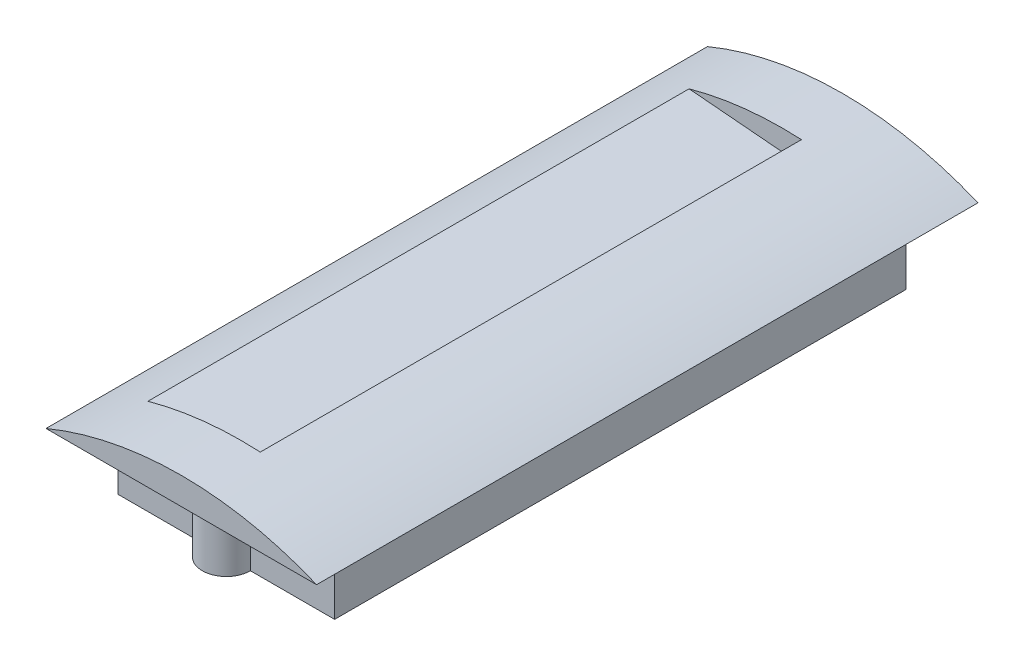
ISO-10303-21;
HEADER;
FILE_DESCRIPTION(('STEP AP214'),'2;1');
FILE_NAME('part.step','',(''),(''),'','','');
FILE_SCHEMA(('AUTOMOTIVE_DESIGN { 1 0 10303 214 1 1 1 1 }'));
ENDSEC;
DATA;
#1=APPLICATION_CONTEXT('core data for automotive mechanical design processes');
#2=APPLICATION_PROTOCOL_DEFINITION('international standard','automotive_design',2000,#1);
#3=PRODUCT_CONTEXT('',#1,'mechanical');
#4=PRODUCT('Part','Part','',(#3));
#5=PRODUCT_RELATED_PRODUCT_CATEGORY('part','',(#4));
#6=PRODUCT_DEFINITION_FORMATION('','',#4);
#7=PRODUCT_DEFINITION_CONTEXT('part definition',#1,'design');
#8=PRODUCT_DEFINITION('design','',#6,#7);
#9=PRODUCT_DEFINITION_SHAPE('','',#8);
#10=(LENGTH_UNIT() NAMED_UNIT(*) SI_UNIT(.MILLI.,.METRE.));
#11=(NAMED_UNIT(*) PLANE_ANGLE_UNIT() SI_UNIT($,.RADIAN.));
#12=(NAMED_UNIT(*) SI_UNIT($,.STERADIAN.) SOLID_ANGLE_UNIT());
#13=UNCERTAINTY_MEASURE_WITH_UNIT(LENGTH_MEASURE(1.E-05),#10,'distance_accuracy_value','');
#14=(GEOMETRIC_REPRESENTATION_CONTEXT(3) GLOBAL_UNCERTAINTY_ASSIGNED_CONTEXT((#13)) GLOBAL_UNIT_ASSIGNED_CONTEXT((#10,
#11,#12)) REPRESENTATION_CONTEXT('',''));
#15=CARTESIAN_POINT('',(0.,0.,0.));
#16=DIRECTION('',(0.,0.,1.));
#17=DIRECTION('',(1.,0.,0.));
#18=AXIS2_PLACEMENT_3D('',#15,#16,#17);
#19=CARTESIAN_POINT('',(22.5,-54.,110.));
#20=DIRECTION('',(0.,0.,-1.));
#21=DIRECTION('',(-1.,0.,0.));
#22=AXIS2_PLACEMENT_3D('',#19,#20,#21);
#23=CYLINDRICAL_SURFACE('',#22,58.5);
#24=CARTESIAN_POINT('',(22.5,-54.,0.));
#25=DIRECTION('',(0.,0.,1.));
#26=DIRECTION('',(-1.,0.,0.));
#27=AXIS2_PLACEMENT_3D('',#24,#25,#26);
#28=CIRCLE('',#27,58.5);
#29=CARTESIAN_POINT('',(45.,0.,0.));
#30=VERTEX_POINT('',#29);
#31=CARTESIAN_POINT('',(0.,0.,0.));
#32=VERTEX_POINT('',#31);
#33=EDGE_CURVE('E209',#30,#32,#28,.T.);
#34=ORIENTED_EDGE('',*,*,#33,.T.);
#35=DIRECTION('',(0.,0.,-1.));
#36=VECTOR('',#35,1.);
#37=CARTESIAN_POINT('',(0.,0.,110.));
#38=LINE('',#37,#36);
#39=CARTESIAN_POINT('',(0.,0.,110.));
#40=VERTEX_POINT('',#39);
#41=EDGE_CURVE('E122',#40,#32,#38,.T.);
#42=ORIENTED_EDGE('',*,*,#41,.F.);
#43=CARTESIAN_POINT('',(22.5,-54.,110.));
#44=DIRECTION('',(0.,0.,1.));
#45=DIRECTION('',(-1.,0.,0.));
#46=AXIS2_PLACEMENT_3D('',#43,#44,#45);
#47=CIRCLE('',#46,58.5);
#48=CARTESIAN_POINT('',(45.,0.,110.));
#49=VERTEX_POINT('',#48);
#50=EDGE_CURVE('E210',#49,#40,#47,.T.);
#51=ORIENTED_EDGE('',*,*,#50,.F.);
#52=DIRECTION('',(0.,0.,-1.));
#53=VECTOR('',#52,1.);
#54=CARTESIAN_POINT('',(45.,0.,110.));
#55=LINE('',#54,#53);
#56=EDGE_CURVE('E216',#49,#30,#55,.T.);
#57=ORIENTED_EDGE('',*,*,#56,.T.);
#58=EDGE_LOOP('',(#34,#42,#51,#57));
#59=FACE_BOUND('',#58,.T.);
#60=CARTESIAN_POINT('',(22.5,-54.,9.99999999999999));
#61=DIRECTION('',(0.,0.,1.));
#62=DIRECTION('',(1.,0.,0.));
#63=AXIS2_PLACEMENT_3D('',#60,#61,#62);
#64=CIRCLE('',#63,58.5);
#65=CARTESIAN_POINT('',(25.6355375998647,4.415908825934,10.));
#66=VERTEX_POINT('',#65);
#67=CARTESIAN_POINT('',(6.95185149151565,2.39596685897064,9.99999999999999));
#68=VERTEX_POINT('',#67);
#69=EDGE_CURVE('E11',#66,#68,#64,.T.);
#70=ORIENTED_EDGE('',*,*,#69,.F.);
#71=DIRECTION('',(0.,0.,1.));
#72=VECTOR('',#71,1.);
#73=CARTESIAN_POINT('',(25.6355375998647,4.415908825934,10.));
#74=LINE('',#73,#72);
#75=CARTESIAN_POINT('',(25.6355375998647,4.415908825934,100.));
#76=VERTEX_POINT('',#75);
#77=EDGE_CURVE('E127',#66,#76,#74,.T.);
#78=ORIENTED_EDGE('',*,*,#77,.T.);
#79=CARTESIAN_POINT('',(22.5,-54.,100.));
#80=DIRECTION('',(0.,0.,1.));
#81=DIRECTION('',(1.,0.,0.));
#82=AXIS2_PLACEMENT_3D('',#79,#80,#81);
#83=CIRCLE('',#82,58.5);
#84=CARTESIAN_POINT('',(6.95185149151565,2.39596685897064,100.));
#85=VERTEX_POINT('',#84);
#86=EDGE_CURVE('E115',#76,#85,#83,.T.);
#87=ORIENTED_EDGE('',*,*,#86,.T.);
#88=DIRECTION('',(0.,0.,-1.));
#89=VECTOR('',#88,1.);
#90=CARTESIAN_POINT('',(6.95185149151565,2.39596685897064,110.));
#91=LINE('',#90,#89);
#92=EDGE_CURVE('E23',#68,#85,#91,.F.);
#93=ORIENTED_EDGE('',*,*,#92,.F.);
#94=EDGE_LOOP('',(#70,#78,#87,#93));
#95=FACE_BOUND('',#94,.T.);
#96=ADVANCED_FACE('F16',(#59,#95),#23,.T.);
#97=CARTESIAN_POINT('',(0.,0.,110.));
#98=DIRECTION('',(0.,1.,0.));
#99=DIRECTION('',(0.,0.,1.));
#100=AXIS2_PLACEMENT_3D('',#97,#98,#99);
#101=PLANE('',#100);
#102=DIRECTION('',(1.,0.,0.));
#103=VECTOR('',#102,1.);
#104=CARTESIAN_POINT('',(0.,0.,0.));
#105=LINE('',#104,#103);
#106=EDGE_CURVE('E214',#32,#30,#105,.T.);
#107=ORIENTED_EDGE('',*,*,#106,.T.);
#108=ORIENTED_EDGE('',*,*,#56,.F.);
#109=DIRECTION('',(1.,0.,0.));
#110=VECTOR('',#109,1.);
#111=CARTESIAN_POINT('',(0.,0.,110.));
#112=LINE('',#111,#110);
#113=EDGE_CURVE('E213',#40,#49,#112,.T.);
#114=ORIENTED_EDGE('',*,*,#113,.F.);
#115=ORIENTED_EDGE('',*,*,#41,.T.);
#116=EDGE_LOOP('',(#107,#108,#114,#115));
#117=FACE_BOUND('',#116,.T.);
#118=DIRECTION('',(1.,0.,0.));
#119=VECTOR('',#118,1.);
#120=CARTESIAN_POINT('',(0.,0.,7.50000000000001));
#121=LINE('',#120,#119);
#122=CARTESIAN_POINT('',(4.49999999999999,0.,7.50000000000001));
#123=VERTEX_POINT('',#122);
#124=CARTESIAN_POINT('',(18.5,0.,7.5));
#125=VERTEX_POINT('',#124);
#126=EDGE_CURVE('E146',#123,#125,#121,.T.);
#127=ORIENTED_EDGE('',*,*,#126,.F.);
#128=DIRECTION('',(0.,0.,1.));
#129=VECTOR('',#128,1.);
#130=CARTESIAN_POINT('',(4.49999999999999,0.,0.));
#131=LINE('',#130,#129);
#132=CARTESIAN_POINT('',(4.49999999999998,0.,102.5));
#133=VERTEX_POINT('',#132);
#134=EDGE_CURVE('E156',#123,#133,#131,.T.);
#135=ORIENTED_EDGE('',*,*,#134,.T.);
#136=DIRECTION('',(1.,0.,0.));
#137=VECTOR('',#136,1.);
#138=CARTESIAN_POINT('',(0.,0.,102.5));
#139=LINE('',#138,#137);
#140=CARTESIAN_POINT('',(18.5,0.,102.5));
#141=VERTEX_POINT('',#140);
#142=EDGE_CURVE('E38',#133,#141,#139,.T.);
#143=ORIENTED_EDGE('',*,*,#142,.T.);
#144=CARTESIAN_POINT('',(22.5,0.,102.5));
#145=DIRECTION('',(0.,-1.,0.));
#146=DIRECTION('',(0.,0.,-1.));
#147=AXIS2_PLACEMENT_3D('',#144,#145,#146);
#148=CIRCLE('',#147,4.);
#149=CARTESIAN_POINT('',(26.5,0.,102.5));
#150=VERTEX_POINT('',#149);
#151=EDGE_CURVE('E186',#150,#141,#148,.T.);
#152=ORIENTED_EDGE('',*,*,#151,.F.);
#153=DIRECTION('',(1.,0.,0.));
#154=VECTOR('',#153,1.);
#155=CARTESIAN_POINT('',(0.,0.,102.5));
#156=LINE('',#155,#154);
#157=CARTESIAN_POINT('',(40.5,0.,102.5));
#158=VERTEX_POINT('',#157);
#159=EDGE_CURVE('E183',#150,#158,#156,.T.);
#160=ORIENTED_EDGE('',*,*,#159,.T.);
#161=DIRECTION('',(0.,0.,1.));
#162=VECTOR('',#161,1.);
#163=CARTESIAN_POINT('',(40.5,0.,0.));
#164=LINE('',#163,#162);
#165=CARTESIAN_POINT('',(40.5,0.,7.5));
#166=VERTEX_POINT('',#165);
#167=EDGE_CURVE('E180',#166,#158,#164,.T.);
#168=ORIENTED_EDGE('',*,*,#167,.F.);
#169=DIRECTION('',(1.,0.,0.));
#170=VECTOR('',#169,1.);
#171=CARTESIAN_POINT('',(0.,0.,7.50000000000001));
#172=LINE('',#171,#170);
#173=CARTESIAN_POINT('',(26.5,0.,7.5));
#174=VERTEX_POINT('',#173);
#175=EDGE_CURVE('E178',#174,#166,#172,.T.);
#176=ORIENTED_EDGE('',*,*,#175,.F.);
#177=CARTESIAN_POINT('',(22.5,0.,7.50000000000002));
#178=DIRECTION('',(0.,-1.,0.));
#179=DIRECTION('',(0.,0.,-1.));
#180=AXIS2_PLACEMENT_3D('',#177,#178,#179);
#181=CIRCLE('',#180,4.);
#182=EDGE_CURVE('E176',#125,#174,#181,.T.);
#183=ORIENTED_EDGE('',*,*,#182,.F.);
#184=EDGE_LOOP('',(#127,#135,#143,#152,#160,#168,#176,#183));
#185=FACE_BOUND('',#184,.T.);
#186=ADVANCED_FACE('F252',(#117,#185),#101,.F.);
#187=CARTESIAN_POINT('',(22.5,-54.,110.));
#188=DIRECTION('',(0.,0.,-1.));
#189=DIRECTION('',(-1.,0.,0.));
#190=AXIS2_PLACEMENT_3D('',#187,#188,#189);
#191=PLANE('',#190);
#192=ORIENTED_EDGE('',*,*,#50,.T.);
#193=ORIENTED_EDGE('',*,*,#113,.T.);
#194=EDGE_LOOP('',(#192,#193));
#195=FACE_BOUND('',#194,.T.);
#196=ADVANCED_FACE('F257',(#195),#191,.F.);
#197=CARTESIAN_POINT('',(22.5,-54.,0.));
#198=DIRECTION('',(0.,0.,-1.));
#199=DIRECTION('',(-1.,0.,0.));
#200=AXIS2_PLACEMENT_3D('',#197,#198,#199);
#201=PLANE('',#200);
#202=ORIENTED_EDGE('',*,*,#33,.F.);
#203=ORIENTED_EDGE('',*,*,#106,.F.);
#204=EDGE_LOOP('',(#202,#203));
#205=FACE_BOUND('',#204,.T.);
#206=ADVANCED_FACE('F264',(#205),#201,.T.);
#207=CARTESIAN_POINT('',(0.,-11.,7.50000000000001));
#208=DIRECTION('',(0.,0.,1.));
#209=DIRECTION('',(1.,0.,0.));
#210=AXIS2_PLACEMENT_3D('',#207,#208,#209);
#211=PLANE('',#210);
#212=ORIENTED_EDGE('',*,*,#126,.T.);
#213=DIRECTION('',(0.,1.,0.));
#214=VECTOR('',#213,1.);
#215=CARTESIAN_POINT('',(18.5,-11.,7.5));
#216=LINE('',#215,#214);
#217=CARTESIAN_POINT('',(18.5,-11.,7.5));
#218=VERTEX_POINT('',#217);
#219=EDGE_CURVE('E207',#218,#125,#216,.T.);
#220=ORIENTED_EDGE('',*,*,#219,.F.);
#221=DIRECTION('',(1.,0.,0.));
#222=VECTOR('',#221,1.);
#223=CARTESIAN_POINT('',(0.,-11.,7.50000000000001));
#224=LINE('',#223,#222);
#225=CARTESIAN_POINT('',(4.49999999999999,-11.,7.50000000000001));
#226=VERTEX_POINT('',#225);
#227=EDGE_CURVE('E152',#226,#218,#224,.T.);
#228=ORIENTED_EDGE('',*,*,#227,.F.);
#229=DIRECTION('',(0.,1.,0.));
#230=VECTOR('',#229,1.);
#231=CARTESIAN_POINT('',(4.49999999999999,-11.,7.50000000000001));
#232=LINE('',#231,#230);
#233=EDGE_CURVE('E173',#226,#123,#232,.T.);
#234=ORIENTED_EDGE('',*,*,#233,.T.);
#235=EDGE_LOOP('',(#212,#220,#228,#234));
#236=FACE_BOUND('',#235,.T.);
#237=ADVANCED_FACE('F272',(#236),#211,.F.);
#238=CARTESIAN_POINT('',(22.5,-11.,7.50000000000002));
#239=DIRECTION('',(0.,1.,0.));
#240=DIRECTION('',(0.,0.,1.));
#241=AXIS2_PLACEMENT_3D('',#238,#239,#240);
#242=CYLINDRICAL_SURFACE('',#241,4.);
#243=ORIENTED_EDGE('',*,*,#182,.T.);
#244=DIRECTION('',(0.,1.,0.));
#245=VECTOR('',#244,1.);
#246=CARTESIAN_POINT('',(26.5,-11.,7.5));
#247=LINE('',#246,#245);
#248=CARTESIAN_POINT('',(26.5,-11.,7.5));
#249=VERTEX_POINT('',#248);
#250=EDGE_CURVE('E204',#249,#174,#247,.T.);
#251=ORIENTED_EDGE('',*,*,#250,.F.);
#252=CARTESIAN_POINT('',(22.5,-11.,7.50000000000002));
#253=DIRECTION('',(0.,-1.,0.));
#254=DIRECTION('',(0.,0.,-1.));
#255=AXIS2_PLACEMENT_3D('',#252,#253,#254);
#256=CIRCLE('',#255,4.);
#257=EDGE_CURVE('E155',#218,#249,#256,.T.);
#258=ORIENTED_EDGE('',*,*,#257,.F.);
#259=ORIENTED_EDGE('',*,*,#219,.T.);
#260=EDGE_LOOP('',(#243,#251,#258,#259));
#261=FACE_BOUND('',#260,.T.);
#262=ADVANCED_FACE('F277',(#261),#242,.T.);
#263=CARTESIAN_POINT('',(0.,-11.,7.50000000000001));
#264=DIRECTION('',(0.,0.,1.));
#265=DIRECTION('',(1.,0.,0.));
#266=AXIS2_PLACEMENT_3D('',#263,#264,#265);
#267=PLANE('',#266);
#268=ORIENTED_EDGE('',*,*,#175,.T.);
#269=DIRECTION('',(0.,1.,0.));
#270=VECTOR('',#269,1.);
#271=CARTESIAN_POINT('',(40.5,-11.,7.5));
#272=LINE('',#271,#270);
#273=CARTESIAN_POINT('',(40.5,-11.,7.5));
#274=VERTEX_POINT('',#273);
#275=EDGE_CURVE('E201',#274,#166,#272,.T.);
#276=ORIENTED_EDGE('',*,*,#275,.F.);
#277=DIRECTION('',(1.,0.,0.));
#278=VECTOR('',#277,1.);
#279=CARTESIAN_POINT('',(0.,-11.,7.50000000000001));
#280=LINE('',#279,#278);
#281=EDGE_CURVE('E158',#249,#274,#280,.T.);
#282=ORIENTED_EDGE('',*,*,#281,.F.);
#283=ORIENTED_EDGE('',*,*,#250,.T.);
#284=EDGE_LOOP('',(#268,#276,#282,#283));
#285=FACE_BOUND('',#284,.T.);
#286=ADVANCED_FACE('F281',(#285),#267,.F.);
#287=CARTESIAN_POINT('',(40.5,-11.,0.));
#288=DIRECTION('',(-1.,0.,0.));
#289=DIRECTION('',(0.,0.,1.));
#290=AXIS2_PLACEMENT_3D('',#287,#288,#289);
#291=PLANE('',#290);
#292=ORIENTED_EDGE('',*,*,#167,.T.);
#293=DIRECTION('',(0.,1.,0.));
#294=VECTOR('',#293,1.);
#295=CARTESIAN_POINT('',(40.5,-11.,102.5));
#296=LINE('',#295,#294);
#297=CARTESIAN_POINT('',(40.5,-11.,102.5));
#298=VERTEX_POINT('',#297);
#299=EDGE_CURVE('E199',#298,#158,#296,.T.);
#300=ORIENTED_EDGE('',*,*,#299,.F.);
#301=DIRECTION('',(0.,0.,1.));
#302=VECTOR('',#301,1.);
#303=CARTESIAN_POINT('',(40.5,-11.,0.));
#304=LINE('',#303,#302);
#305=EDGE_CURVE('E160',#274,#298,#304,.T.);
#306=ORIENTED_EDGE('',*,*,#305,.F.);
#307=ORIENTED_EDGE('',*,*,#275,.T.);
#308=EDGE_LOOP('',(#292,#300,#306,#307));
#309=FACE_BOUND('',#308,.T.);
#310=ADVANCED_FACE('F285',(#309),#291,.F.);
#311=CARTESIAN_POINT('',(0.,-11.,102.5));
#312=DIRECTION('',(0.,0.,1.));
#313=DIRECTION('',(1.,0.,0.));
#314=AXIS2_PLACEMENT_3D('',#311,#312,#313);
#315=PLANE('',#314);
#316=ORIENTED_EDGE('',*,*,#159,.F.);
#317=DIRECTION('',(0.,1.,0.));
#318=VECTOR('',#317,1.);
#319=CARTESIAN_POINT('',(26.5,-11.,102.5));
#320=LINE('',#319,#318);
#321=CARTESIAN_POINT('',(26.5,-11.,102.5));
#322=VERTEX_POINT('',#321);
#323=EDGE_CURVE('E197',#322,#150,#320,.T.);
#324=ORIENTED_EDGE('',*,*,#323,.F.);
#325=DIRECTION('',(1.,0.,0.));
#326=VECTOR('',#325,1.);
#327=CARTESIAN_POINT('',(0.,-11.,102.5));
#328=LINE('',#327,#326);
#329=EDGE_CURVE('E162',#322,#298,#328,.T.);
#330=ORIENTED_EDGE('',*,*,#329,.T.);
#331=ORIENTED_EDGE('',*,*,#299,.T.);
#332=EDGE_LOOP('',(#316,#324,#330,#331));
#333=FACE_BOUND('',#332,.T.);
#334=ADVANCED_FACE('F289',(#333),#315,.T.);
#335=CARTESIAN_POINT('',(22.5,-11.,102.5));
#336=DIRECTION('',(0.,1.,0.));
#337=DIRECTION('',(0.,0.,1.));
#338=AXIS2_PLACEMENT_3D('',#335,#336,#337);
#339=CYLINDRICAL_SURFACE('',#338,4.);
#340=ORIENTED_EDGE('',*,*,#151,.T.);
#341=DIRECTION('',(0.,1.,0.));
#342=VECTOR('',#341,1.);
#343=CARTESIAN_POINT('',(18.5,-11.,102.5));
#344=LINE('',#343,#342);
#345=CARTESIAN_POINT('',(18.5,-11.,102.5));
#346=VERTEX_POINT('',#345);
#347=EDGE_CURVE('E195',#346,#141,#344,.T.);
#348=ORIENTED_EDGE('',*,*,#347,.F.);
#349=CARTESIAN_POINT('',(22.5,-11.,102.5));
#350=DIRECTION('',(0.,-1.,0.));
#351=DIRECTION('',(0.,0.,-1.));
#352=AXIS2_PLACEMENT_3D('',#349,#350,#351);
#353=CIRCLE('',#352,4.);
#354=EDGE_CURVE('E165',#322,#346,#353,.T.);
#355=ORIENTED_EDGE('',*,*,#354,.F.);
#356=ORIENTED_EDGE('',*,*,#323,.T.);
#357=EDGE_LOOP('',(#340,#348,#355,#356));
#358=FACE_BOUND('',#357,.T.);
#359=ADVANCED_FACE('F293',(#358),#339,.T.);
#360=CARTESIAN_POINT('',(0.,-11.,102.5));
#361=DIRECTION('',(0.,0.,1.));
#362=DIRECTION('',(1.,0.,0.));
#363=AXIS2_PLACEMENT_3D('',#360,#361,#362);
#364=PLANE('',#363);
#365=ORIENTED_EDGE('',*,*,#142,.F.);
#366=DIRECTION('',(0.,1.,0.));
#367=VECTOR('',#366,1.);
#368=CARTESIAN_POINT('',(4.49999999999998,-11.,102.5));
#369=LINE('',#368,#367);
#370=CARTESIAN_POINT('',(4.49999999999998,-11.,102.5));
#371=VERTEX_POINT('',#370);
#372=EDGE_CURVE('E193',#371,#133,#369,.T.);
#373=ORIENTED_EDGE('',*,*,#372,.F.);
#374=DIRECTION('',(1.,0.,0.));
#375=VECTOR('',#374,1.);
#376=CARTESIAN_POINT('',(0.,-11.,102.5));
#377=LINE('',#376,#375);
#378=EDGE_CURVE('E167',#371,#346,#377,.T.);
#379=ORIENTED_EDGE('',*,*,#378,.T.);
#380=ORIENTED_EDGE('',*,*,#347,.T.);
#381=EDGE_LOOP('',(#365,#373,#379,#380));
#382=FACE_BOUND('',#381,.T.);
#383=ADVANCED_FACE('F297',(#382),#364,.T.);
#384=CARTESIAN_POINT('',(4.49999999999999,-11.,0.));
#385=DIRECTION('',(-1.,0.,0.));
#386=DIRECTION('',(0.,0.,1.));
#387=AXIS2_PLACEMENT_3D('',#384,#385,#386);
#388=PLANE('',#387);
#389=ORIENTED_EDGE('',*,*,#134,.F.);
#390=ORIENTED_EDGE('',*,*,#233,.F.);
#391=DIRECTION('',(0.,0.,1.));
#392=VECTOR('',#391,1.);
#393=CARTESIAN_POINT('',(4.49999999999999,-11.,0.));
#394=LINE('',#393,#392);
#395=EDGE_CURVE('E170',#226,#371,#394,.T.);
#396=ORIENTED_EDGE('',*,*,#395,.T.);
#397=ORIENTED_EDGE('',*,*,#372,.T.);
#398=EDGE_LOOP('',(#389,#390,#396,#397));
#399=FACE_BOUND('',#398,.T.);
#400=ADVANCED_FACE('F301',(#399),#388,.T.);
#401=CARTESIAN_POINT('',(0.,-11.,0.));
#402=DIRECTION('',(0.,-1.,0.));
#403=DIRECTION('',(0.,0.,-1.));
#404=AXIS2_PLACEMENT_3D('',#401,#402,#403);
#405=PLANE('',#404);
#406=CARTESIAN_POINT('',(22.5,-11.,102.5));
#407=DIRECTION('',(0.,-1.,0.));
#408=DIRECTION('',(0.,0.,-1.));
#409=AXIS2_PLACEMENT_3D('',#406,#407,#408);
#410=CIRCLE('',#409,1.6);
#411=CARTESIAN_POINT('',(22.5,-11.,100.9));
#412=VERTEX_POINT('',#411);
#413=EDGE_CURVE('E147',#412,#412,#410,.T.);
#414=ORIENTED_EDGE('',*,*,#413,.F.);
#415=EDGE_LOOP('',(#414));
#416=FACE_BOUND('',#415,.T.);
#417=CARTESIAN_POINT('',(22.5,-11.,7.50000000000002));
#418=DIRECTION('',(0.,-1.,0.));
#419=DIRECTION('',(0.,0.,-1.));
#420=AXIS2_PLACEMENT_3D('',#417,#418,#419);
#421=CIRCLE('',#420,1.6);
#422=CARTESIAN_POINT('',(22.5,-11.,5.90000000000002));
#423=VERTEX_POINT('',#422);
#424=EDGE_CURVE('E134',#423,#423,#421,.T.);
#425=ORIENTED_EDGE('',*,*,#424,.F.);
#426=EDGE_LOOP('',(#425));
#427=FACE_BOUND('',#426,.T.);
#428=ORIENTED_EDGE('',*,*,#227,.T.);
#429=ORIENTED_EDGE('',*,*,#257,.T.);
#430=ORIENTED_EDGE('',*,*,#281,.T.);
#431=ORIENTED_EDGE('',*,*,#305,.T.);
#432=ORIENTED_EDGE('',*,*,#329,.F.);
#433=ORIENTED_EDGE('',*,*,#354,.T.);
#434=ORIENTED_EDGE('',*,*,#378,.F.);
#435=ORIENTED_EDGE('',*,*,#395,.F.);
#436=EDGE_LOOP('',(#428,#429,#430,#431,#432,#433,#434,#435));
#437=FACE_BOUND('',#436,.T.);
#438=ADVANCED_FACE('F304',(#416,#427,#437),#405,.T.);
#439=CARTESIAN_POINT('',(22.5,0.,7.50000000000002));
#440=DIRECTION('',(0.,-1.,0.));
#441=DIRECTION('',(0.,0.,-1.));
#442=AXIS2_PLACEMENT_3D('',#439,#440,#441);
#443=CYLINDRICAL_SURFACE('',#442,1.6);
#444=CARTESIAN_POINT('',(22.5,0.,7.50000000000002));
#445=DIRECTION('',(0.,-1.,0.));
#446=DIRECTION('',(0.,0.,-1.));
#447=AXIS2_PLACEMENT_3D('',#444,#445,#446);
#448=CIRCLE('',#447,1.6);
#449=CARTESIAN_POINT('',(22.5,0.,5.90000000000002));
#450=VERTEX_POINT('',#449);
#451=EDGE_CURVE('E137',#450,#450,#448,.T.);
#452=ORIENTED_EDGE('',*,*,#451,.F.);
#453=EDGE_LOOP('',(#452));
#454=FACE_BOUND('',#453,.T.);
#455=ORIENTED_EDGE('',*,*,#424,.T.);
#456=EDGE_LOOP('',(#455));
#457=FACE_BOUND('',#456,.T.);
#458=ADVANCED_FACE('F308',(#454,#457),#443,.F.);
#459=CARTESIAN_POINT('',(22.5,0.,7.50000000000002));
#460=DIRECTION('',(0.,-1.,0.));
#461=DIRECTION('',(0.,0.,-1.));
#462=AXIS2_PLACEMENT_3D('',#459,#460,#461);
#463=PLANE('',#462);
#464=ORIENTED_EDGE('',*,*,#451,.T.);
#465=EDGE_LOOP('',(#464));
#466=FACE_BOUND('',#465,.T.);
#467=ADVANCED_FACE('F312',(#466),#463,.T.);
#468=CARTESIAN_POINT('',(22.5,0.,102.5));
#469=DIRECTION('',(0.,-1.,0.));
#470=DIRECTION('',(0.,0.,-1.));
#471=AXIS2_PLACEMENT_3D('',#468,#469,#470);
#472=CYLINDRICAL_SURFACE('',#471,1.6);
#473=CARTESIAN_POINT('',(22.5,0.,102.5));
#474=DIRECTION('',(0.,-1.,0.));
#475=DIRECTION('',(0.,0.,-1.));
#476=AXIS2_PLACEMENT_3D('',#473,#474,#475);
#477=CIRCLE('',#476,1.6);
#478=CARTESIAN_POINT('',(22.5,0.,100.9));
#479=VERTEX_POINT('',#478);
#480=EDGE_CURVE('E143',#479,#479,#477,.T.);
#481=ORIENTED_EDGE('',*,*,#480,.F.);
#482=EDGE_LOOP('',(#481));
#483=FACE_BOUND('',#482,.T.);
#484=ORIENTED_EDGE('',*,*,#413,.T.);
#485=EDGE_LOOP('',(#484));
#486=FACE_BOUND('',#485,.T.);
#487=ADVANCED_FACE('F316',(#483,#486),#472,.F.);
#488=CARTESIAN_POINT('',(22.5,0.,102.5));
#489=DIRECTION('',(0.,-1.,0.));
#490=DIRECTION('',(0.,0.,-1.));
#491=AXIS2_PLACEMENT_3D('',#488,#489,#490);
#492=PLANE('',#491);
#493=ORIENTED_EDGE('',*,*,#480,.T.);
#494=EDGE_LOOP('',(#493));
#495=FACE_BOUND('',#494,.T.);
#496=ADVANCED_FACE('F249',(#495),#492,.T.);
#497=CARTESIAN_POINT('',(28.8796522942782,0.497190811804058,10.));
#498=DIRECTION('',(0.086269350145016,0.996271850061797,0.));
#499=DIRECTION('',(-0.996271850061798,0.086269350145016,0.));
#500=AXIS2_PLACEMENT_3D('',#497,#498,#499);
#501=PLANE('',#500);
#502=ORIENTED_EDGE('',*,*,#92,.T.);
#503=DIRECTION('',(-0.996271850061797,0.086269350145016,0.));
#504=VECTOR('',#503,1.);
#505=CARTESIAN_POINT('',(28.8796522942782,0.497190811804058,100.));
#506=LINE('',#505,#504);
#507=CARTESIAN_POINT('',(28.8796522942782,0.497190811804057,100.));
#508=VERTEX_POINT('',#507);
#509=EDGE_CURVE('E30',#508,#85,#506,.T.);
#510=ORIENTED_EDGE('',*,*,#509,.F.);
#511=DIRECTION('',(0.,0.,1.));
#512=VECTOR('',#511,1.);
#513=CARTESIAN_POINT('',(28.8796522942782,0.497190811804057,10.));
#514=LINE('',#513,#512);
#515=CARTESIAN_POINT('',(28.8796522942782,0.497190811804057,10.));
#516=VERTEX_POINT('',#515);
#517=EDGE_CURVE('E139',#516,#508,#514,.T.);
#518=ORIENTED_EDGE('',*,*,#517,.F.);
#519=DIRECTION('',(-0.996271850061797,0.086269350145016,0.));
#520=VECTOR('',#519,1.);
#521=CARTESIAN_POINT('',(28.8796522942782,0.497190811804058,10.));
#522=LINE('',#521,#520);
#523=EDGE_CURVE('E228',#516,#68,#522,.T.);
#524=ORIENTED_EDGE('',*,*,#523,.T.);
#525=EDGE_LOOP('',(#502,#510,#518,#524));
#526=FACE_BOUND('',#525,.T.);
#527=ADVANCED_FACE('F225',(#526),#501,.T.);
#528=CARTESIAN_POINT('',(28.3547584944452,1.80605732164043,10.));
#529=DIRECTION('',(0.,0.,1.));
#530=DIRECTION('',(1.,0.,0.));
#531=AXIS2_PLACEMENT_3D('',#528,#529,#530);
#532=PLANE('',#531);
#533=ORIENTED_EDGE('',*,*,#69,.T.);
#534=ORIENTED_EDGE('',*,*,#523,.F.);
#535=CARTESIAN_POINT('',(28.3547584944452,1.80605732164043,10.));
#536=DIRECTION('',(0.,0.,-1.));
#537=DIRECTION('',(1.,0.,0.));
#538=AXIS2_PLACEMENT_3D('',#535,#536,#537);
#539=CIRCLE('',#538,1.41019326394447);
#540=CARTESIAN_POINT('',(28.8796522942782,3.11492383147681,10.));
#541=VERTEX_POINT('',#540);
#542=EDGE_CURVE('E231',#541,#516,#539,.T.);
#543=ORIENTED_EDGE('',*,*,#542,.F.);
#544=DIRECTION('',(0.928146902485783,-0.372214088134833,0.));
#545=VECTOR('',#544,1.);
#546=CARTESIAN_POINT('',(25.6355375998647,4.415908825934,10.));
#547=LINE('',#546,#545);
#548=EDGE_CURVE('E233',#66,#541,#547,.T.);
#549=ORIENTED_EDGE('',*,*,#548,.F.);
#550=EDGE_LOOP('',(#533,#534,#543,#549));
#551=FACE_BOUND('',#550,.T.);
#552=ADVANCED_FACE('F240',(#551),#532,.T.);
#553=CARTESIAN_POINT('',(28.3547584944452,1.80605732164043,100.));
#554=DIRECTION('',(0.,0.,1.));
#555=DIRECTION('',(1.,0.,0.));
#556=AXIS2_PLACEMENT_3D('',#553,#554,#555);
#557=PLANE('',#556);
#558=DIRECTION('',(0.928146902485783,-0.372214088134833,0.));
#559=VECTOR('',#558,1.);
#560=CARTESIAN_POINT('',(25.6355375998647,4.415908825934,100.));
#561=LINE('',#560,#559);
#562=CARTESIAN_POINT('',(28.8796522942782,3.11492383147681,100.));
#563=VERTEX_POINT('',#562);
#564=EDGE_CURVE('E118',#76,#563,#561,.T.);
#565=ORIENTED_EDGE('',*,*,#564,.T.);
#566=CARTESIAN_POINT('',(28.3547584944452,1.80605732164043,100.));
#567=DIRECTION('',(0.,0.,-1.));
#568=DIRECTION('',(1.,0.,0.));
#569=AXIS2_PLACEMENT_3D('',#566,#567,#568);
#570=CIRCLE('',#569,1.41019326394447);
#571=EDGE_CURVE('E132',#563,#508,#570,.T.);
#572=ORIENTED_EDGE('',*,*,#571,.T.);
#573=ORIENTED_EDGE('',*,*,#509,.T.);
#574=ORIENTED_EDGE('',*,*,#86,.F.);
#575=EDGE_LOOP('',(#565,#572,#573,#574));
#576=FACE_BOUND('',#575,.T.);
#577=ADVANCED_FACE('F117',(#576),#557,.F.);
#578=CARTESIAN_POINT('',(25.6355375998647,4.415908825934,10.));
#579=DIRECTION('',(-0.372214088134833,-0.928146902485783,0.));
#580=DIRECTION('',(0.928146902485784,-0.372214088134833,0.));
#581=AXIS2_PLACEMENT_3D('',#578,#579,#580);
#582=PLANE('',#581);
#583=ORIENTED_EDGE('',*,*,#77,.F.);
#584=ORIENTED_EDGE('',*,*,#548,.T.);
#585=DIRECTION('',(0.,0.,1.));
#586=VECTOR('',#585,1.);
#587=CARTESIAN_POINT('',(28.8796522942782,3.11492383147681,10.));
#588=LINE('',#587,#586);
#589=EDGE_CURVE('E130',#541,#563,#588,.T.);
#590=ORIENTED_EDGE('',*,*,#589,.T.);
#591=ORIENTED_EDGE('',*,*,#564,.F.);
#592=EDGE_LOOP('',(#583,#584,#590,#591));
#593=FACE_BOUND('',#592,.T.);
#594=ADVANCED_FACE('F126',(#593),#582,.T.);
#595=CARTESIAN_POINT('',(28.3547584944452,1.80605732164043,10.));
#596=DIRECTION('',(0.,0.,1.));
#597=DIRECTION('',(1.,0.,0.));
#598=AXIS2_PLACEMENT_3D('',#595,#596,#597);
#599=CYLINDRICAL_SURFACE('',#598,1.41019326394447);
#600=ORIENTED_EDGE('',*,*,#589,.F.);
#601=ORIENTED_EDGE('',*,*,#542,.T.);
#602=ORIENTED_EDGE('',*,*,#517,.T.);
#603=ORIENTED_EDGE('',*,*,#571,.F.);
#604=EDGE_LOOP('',(#600,#601,#602,#603));
#605=FACE_BOUND('',#604,.T.);
#606=ADVANCED_FACE('F239',(#605),#599,.F.);
#607=CLOSED_SHELL('',(#96,#186,#196,#206,#237,#262,#286,#310,#334,#359,#383,#400,#438,#458,#467,
#487,#496,#527,#552,#577,#594,#606));
#608=MANIFOLD_SOLID_BREP('B1',#607);
#609=ADVANCED_BREP_SHAPE_REPRESENTATION('',(#18,#608),#14);
#610=SHAPE_DEFINITION_REPRESENTATION(#9,#609);
ENDSEC;
END-ISO-10303-21;
